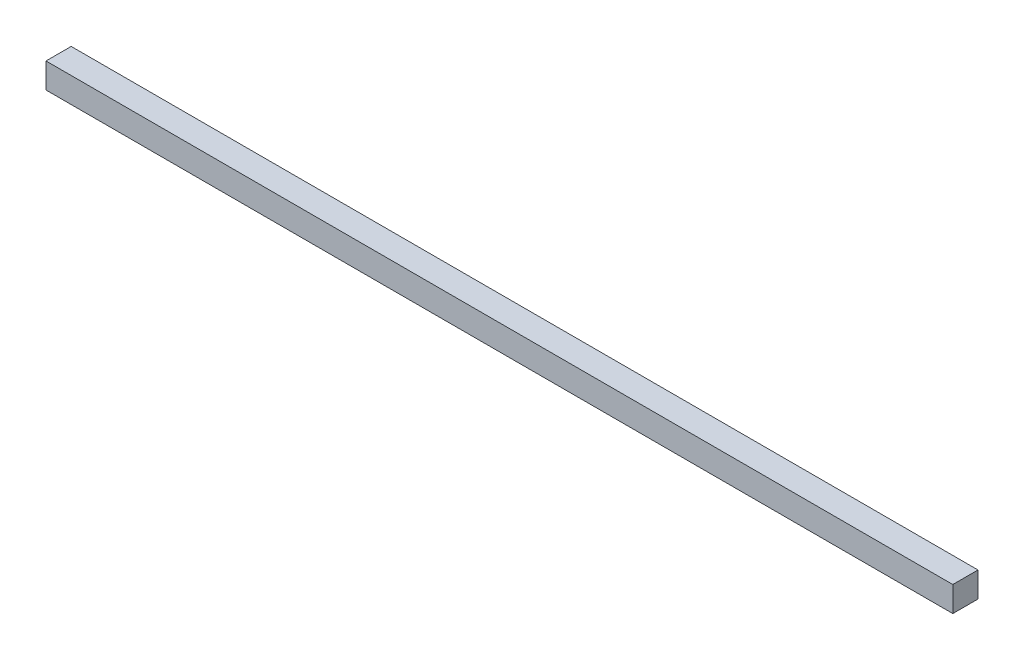
ISO-10303-21;
HEADER;
FILE_DESCRIPTION(('STEP AP214'),'2;1');
FILE_NAME('part.step','',(''),(''),'','','');
FILE_SCHEMA(('AUTOMOTIVE_DESIGN { 1 0 10303 214 1 1 1 1 }'));
ENDSEC;
DATA;
#1=APPLICATION_CONTEXT('core data for automotive mechanical design processes');
#2=APPLICATION_PROTOCOL_DEFINITION('international standard','automotive_design',2000,#1);
#3=PRODUCT_CONTEXT('',#1,'mechanical');
#4=PRODUCT('Part','Part','',(#3));
#5=PRODUCT_RELATED_PRODUCT_CATEGORY('part','',(#4));
#6=PRODUCT_DEFINITION_FORMATION('','',#4);
#7=PRODUCT_DEFINITION_CONTEXT('part definition',#1,'design');
#8=PRODUCT_DEFINITION('design','',#6,#7);
#9=PRODUCT_DEFINITION_SHAPE('','',#8);
#10=(LENGTH_UNIT() NAMED_UNIT(*) SI_UNIT(.MILLI.,.METRE.));
#11=(NAMED_UNIT(*) PLANE_ANGLE_UNIT() SI_UNIT($,.RADIAN.));
#12=(NAMED_UNIT(*) SI_UNIT($,.STERADIAN.) SOLID_ANGLE_UNIT());
#13=UNCERTAINTY_MEASURE_WITH_UNIT(LENGTH_MEASURE(1.E-05),#10,'distance_accuracy_value','');
#14=(GEOMETRIC_REPRESENTATION_CONTEXT(3) GLOBAL_UNCERTAINTY_ASSIGNED_CONTEXT((#13)) GLOBAL_UNIT_ASSIGNED_CONTEXT((#10,
#11,#12)) REPRESENTATION_CONTEXT('',''));
#15=CARTESIAN_POINT('',(0.,0.,0.));
#16=DIRECTION('',(0.,0.,1.));
#17=DIRECTION('',(1.,0.,0.));
#18=AXIS2_PLACEMENT_3D('',#15,#16,#17);
#19=CARTESIAN_POINT('',(4572.00000000001,-127.,254.));
#20=DIRECTION('',(-1.,0.,0.));
#21=DIRECTION('',(0.,0.,1.));
#22=AXIS2_PLACEMENT_3D('',#19,#20,#21);
#23=PLANE('',#22);
#24=DIRECTION('',(0.,1.,0.));
#25=VECTOR('',#24,1.);
#26=CARTESIAN_POINT('',(4572.00000000001,-127.,0.));
#27=LINE('',#26,#25);
#28=CARTESIAN_POINT('',(4572.00000000001,-127.,0.));
#29=VERTEX_POINT('',#28);
#30=CARTESIAN_POINT('',(4572.00000000001,127.,0.));
#31=VERTEX_POINT('',#30);
#32=EDGE_CURVE('E107',#29,#31,#27,.T.);
#33=ORIENTED_EDGE('',*,*,#32,.T.);
#34=DIRECTION('',(0.,0.,-1.));
#35=VECTOR('',#34,1.);
#36=CARTESIAN_POINT('',(4572.00000000001,127.,254.));
#37=LINE('',#36,#35);
#38=CARTESIAN_POINT('',(4572.00000000001,127.,254.));
#39=VERTEX_POINT('',#38);
#40=EDGE_CURVE('E11',#39,#31,#37,.T.);
#41=ORIENTED_EDGE('',*,*,#40,.F.);
#42=DIRECTION('',(0.,1.,0.));
#43=VECTOR('',#42,1.);
#44=CARTESIAN_POINT('',(4572.00000000001,-127.,254.));
#45=LINE('',#44,#43);
#46=CARTESIAN_POINT('',(4572.00000000001,-127.,254.));
#47=VERTEX_POINT('',#46);
#48=EDGE_CURVE('E91',#47,#39,#45,.T.);
#49=ORIENTED_EDGE('',*,*,#48,.F.);
#50=DIRECTION('',(0.,0.,-1.));
#51=VECTOR('',#50,1.);
#52=CARTESIAN_POINT('',(4572.00000000001,-127.,254.));
#53=LINE('',#52,#51);
#54=EDGE_CURVE('E103',#47,#29,#53,.T.);
#55=ORIENTED_EDGE('',*,*,#54,.T.);
#56=EDGE_LOOP('',(#33,#41,#49,#55));
#57=FACE_BOUND('',#56,.T.);
#58=ADVANCED_FACE('F39',(#57),#23,.F.);
#59=CARTESIAN_POINT('',(-4571.99999999999,127.,254.));
#60=DIRECTION('',(0.,-1.,0.));
#61=DIRECTION('',(0.,0.,-1.));
#62=AXIS2_PLACEMENT_3D('',#59,#60,#61);
#63=PLANE('',#62);
#64=DIRECTION('',(-1.,0.,0.));
#65=VECTOR('',#64,1.);
#66=CARTESIAN_POINT('',(-4571.99999999999,127.,0.));
#67=LINE('',#66,#65);
#68=CARTESIAN_POINT('',(-4571.99999999999,127.,0.));
#69=VERTEX_POINT('',#68);
#70=EDGE_CURVE('E96',#31,#69,#67,.T.);
#71=ORIENTED_EDGE('',*,*,#70,.T.);
#72=DIRECTION('',(0.,0.,-1.));
#73=VECTOR('',#72,1.);
#74=CARTESIAN_POINT('',(-4571.99999999999,127.,254.));
#75=LINE('',#74,#73);
#76=CARTESIAN_POINT('',(-4571.99999999999,127.,254.));
#77=VERTEX_POINT('',#76);
#78=EDGE_CURVE('E48',#77,#69,#75,.T.);
#79=ORIENTED_EDGE('',*,*,#78,.F.);
#80=DIRECTION('',(-1.,0.,0.));
#81=VECTOR('',#80,1.);
#82=CARTESIAN_POINT('',(-4571.99999999999,127.,254.));
#83=LINE('',#82,#81);
#84=EDGE_CURVE('E86',#39,#77,#83,.T.);
#85=ORIENTED_EDGE('',*,*,#84,.F.);
#86=ORIENTED_EDGE('',*,*,#40,.T.);
#87=EDGE_LOOP('',(#71,#79,#85,#86));
#88=FACE_BOUND('',#87,.T.);
#89=ADVANCED_FACE('F95',(#88),#63,.F.);
#90=CARTESIAN_POINT('',(-4571.99999999999,-127.,254.));
#91=DIRECTION('',(1.,0.,0.));
#92=DIRECTION('',(0.,0.,-1.));
#93=AXIS2_PLACEMENT_3D('',#90,#91,#92);
#94=PLANE('',#93);
#95=DIRECTION('',(0.,-1.,0.));
#96=VECTOR('',#95,1.);
#97=CARTESIAN_POINT('',(-4571.99999999999,-127.,0.));
#98=LINE('',#97,#96);
#99=CARTESIAN_POINT('',(-4571.99999999999,-127.,0.));
#100=VERTEX_POINT('',#99);
#101=EDGE_CURVE('E73',#69,#100,#98,.T.);
#102=ORIENTED_EDGE('',*,*,#101,.T.);
#103=DIRECTION('',(0.,0.,-1.));
#104=VECTOR('',#103,1.);
#105=CARTESIAN_POINT('',(-4571.99999999999,-127.,254.));
#106=LINE('',#105,#104);
#107=CARTESIAN_POINT('',(-4571.99999999999,-127.,254.));
#108=VERTEX_POINT('',#107);
#109=EDGE_CURVE('E98',#108,#100,#106,.T.);
#110=ORIENTED_EDGE('',*,*,#109,.F.);
#111=DIRECTION('',(0.,-1.,0.));
#112=VECTOR('',#111,1.);
#113=CARTESIAN_POINT('',(-4571.99999999999,-127.,254.));
#114=LINE('',#113,#112);
#115=EDGE_CURVE('E89',#77,#108,#114,.T.);
#116=ORIENTED_EDGE('',*,*,#115,.F.);
#117=ORIENTED_EDGE('',*,*,#78,.T.);
#118=EDGE_LOOP('',(#102,#110,#116,#117));
#119=FACE_BOUND('',#118,.T.);
#120=ADVANCED_FACE('F99',(#119),#94,.F.);
#121=CARTESIAN_POINT('',(-4571.99999999999,-127.,254.));
#122=DIRECTION('',(0.,1.,0.));
#123=DIRECTION('',(0.,0.,1.));
#124=AXIS2_PLACEMENT_3D('',#121,#122,#123);
#125=PLANE('',#124);
#126=DIRECTION('',(1.,0.,0.));
#127=VECTOR('',#126,1.);
#128=CARTESIAN_POINT('',(-4571.99999999999,-127.,0.));
#129=LINE('',#128,#127);
#130=EDGE_CURVE('E79',#100,#29,#129,.T.);
#131=ORIENTED_EDGE('',*,*,#130,.T.);
#132=ORIENTED_EDGE('',*,*,#54,.F.);
#133=DIRECTION('',(1.,0.,0.));
#134=VECTOR('',#133,1.);
#135=CARTESIAN_POINT('',(-4571.99999999999,-127.,254.));
#136=LINE('',#135,#134);
#137=EDGE_CURVE('E56',#108,#47,#136,.T.);
#138=ORIENTED_EDGE('',*,*,#137,.F.);
#139=ORIENTED_EDGE('',*,*,#109,.T.);
#140=EDGE_LOOP('',(#131,#132,#138,#139));
#141=FACE_BOUND('',#140,.T.);
#142=ADVANCED_FACE('F120',(#141),#125,.F.);
#143=CARTESIAN_POINT('',(0.,0.,254.));
#144=DIRECTION('',(0.,0.,-1.));
#145=DIRECTION('',(-1.,0.,0.));
#146=AXIS2_PLACEMENT_3D('',#143,#144,#145);
#147=PLANE('',#146);
#148=ORIENTED_EDGE('',*,*,#48,.T.);
#149=ORIENTED_EDGE('',*,*,#84,.T.);
#150=ORIENTED_EDGE('',*,*,#115,.T.);
#151=ORIENTED_EDGE('',*,*,#137,.T.);
#152=EDGE_LOOP('',(#148,#149,#150,#151));
#153=FACE_BOUND('',#152,.T.);
#154=ADVANCED_FACE('F87',(#153),#147,.F.);
#155=CARTESIAN_POINT('',(0.,0.,0.));
#156=DIRECTION('',(0.,0.,-1.));
#157=DIRECTION('',(-1.,0.,0.));
#158=AXIS2_PLACEMENT_3D('',#155,#156,#157);
#159=PLANE('',#158);
#160=ORIENTED_EDGE('',*,*,#32,.F.);
#161=ORIENTED_EDGE('',*,*,#130,.F.);
#162=ORIENTED_EDGE('',*,*,#101,.F.);
#163=ORIENTED_EDGE('',*,*,#70,.F.);
#164=EDGE_LOOP('',(#160,#161,#162,#163));
#165=FACE_BOUND('',#164,.T.);
#166=ADVANCED_FACE('F123',(#165),#159,.T.);
#167=CLOSED_SHELL('',(#58,#89,#120,#142,#154,#166));
#168=MANIFOLD_SOLID_BREP('B2',#167);
#169=ADVANCED_BREP_SHAPE_REPRESENTATION('',(#18,#168),#14);
#170=SHAPE_DEFINITION_REPRESENTATION(#9,#169);
ENDSEC;
END-ISO-10303-21;
